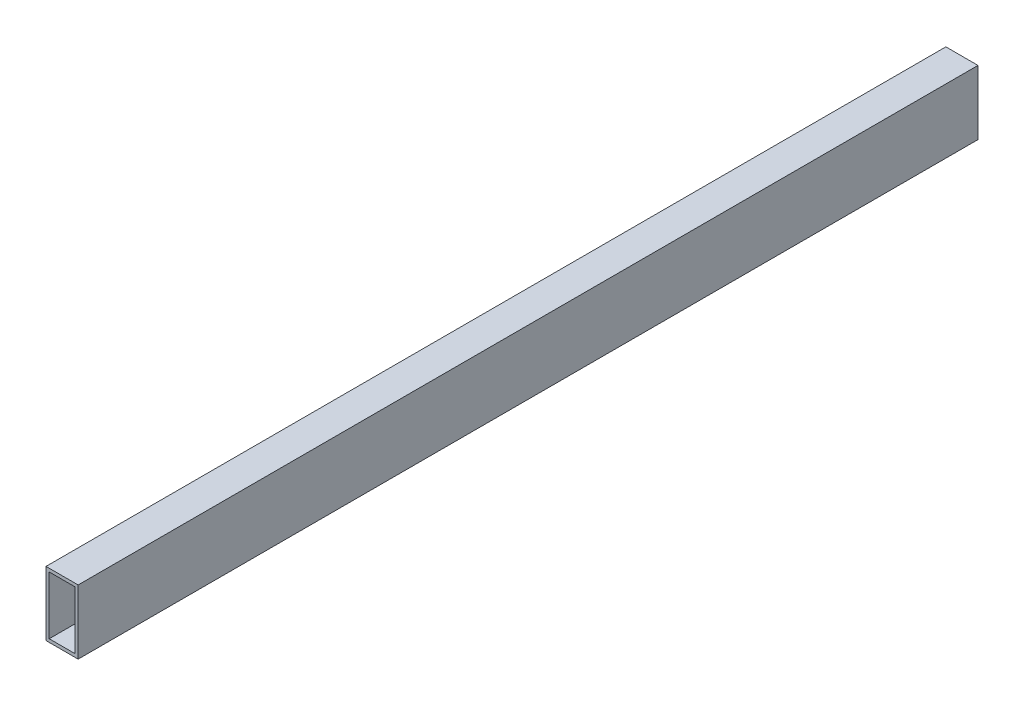
ISO-10303-21;
HEADER;
FILE_DESCRIPTION(('STEP AP214'),'2;1');
FILE_NAME('part.step','',(''),(''),'','','');
FILE_SCHEMA(('AUTOMOTIVE_DESIGN { 1 0 10303 214 1 1 1 1 }'));
ENDSEC;
DATA;
#1=APPLICATION_CONTEXT('core data for automotive mechanical design processes');
#2=APPLICATION_PROTOCOL_DEFINITION('international standard','automotive_design',2000,#1);
#3=PRODUCT_CONTEXT('',#1,'mechanical');
#4=PRODUCT('Part','Part','',(#3));
#5=PRODUCT_RELATED_PRODUCT_CATEGORY('part','',(#4));
#6=PRODUCT_DEFINITION_FORMATION('','',#4);
#7=PRODUCT_DEFINITION_CONTEXT('part definition',#1,'design');
#8=PRODUCT_DEFINITION('design','',#6,#7);
#9=PRODUCT_DEFINITION_SHAPE('','',#8);
#10=(LENGTH_UNIT() NAMED_UNIT(*) SI_UNIT(.MILLI.,.METRE.));
#11=(NAMED_UNIT(*) PLANE_ANGLE_UNIT() SI_UNIT($,.RADIAN.));
#12=(NAMED_UNIT(*) SI_UNIT($,.STERADIAN.) SOLID_ANGLE_UNIT());
#13=UNCERTAINTY_MEASURE_WITH_UNIT(LENGTH_MEASURE(1.E-05),#10,'distance_accuracy_value','');
#14=(GEOMETRIC_REPRESENTATION_CONTEXT(3) GLOBAL_UNCERTAINTY_ASSIGNED_CONTEXT((#13)) GLOBAL_UNIT_ASSIGNED_CONTEXT((#10,
#11,#12)) REPRESENTATION_CONTEXT('',''));
#15=CARTESIAN_POINT('',(0.,0.,0.));
#16=DIRECTION('',(0.,0.,1.));
#17=DIRECTION('',(1.,0.,0.));
#18=AXIS2_PLACEMENT_3D('',#15,#16,#17);
#19=CARTESIAN_POINT('',(0.,0.,280.));
#20=DIRECTION('',(0.,0.,-1.));
#21=DIRECTION('',(-1.,0.,0.));
#22=AXIS2_PLACEMENT_3D('',#19,#20,#21);
#23=PLANE('',#22);
#24=DIRECTION('',(0.,1.,0.));
#25=VECTOR('',#24,1.);
#26=CARTESIAN_POINT('',(5.,-10.,280.));
#27=LINE('',#26,#25);
#28=CARTESIAN_POINT('',(5.,-10.,280.));
#29=VERTEX_POINT('',#28);
#30=CARTESIAN_POINT('',(5.,10.,280.));
#31=VERTEX_POINT('',#30);
#32=EDGE_CURVE('E138',#29,#31,#27,.T.);
#33=ORIENTED_EDGE('',*,*,#32,.T.);
#34=DIRECTION('',(-1.,0.,0.));
#35=VECTOR('',#34,1.);
#36=CARTESIAN_POINT('',(-5.,10.,280.));
#37=LINE('',#36,#35);
#38=CARTESIAN_POINT('',(-5.,10.,280.));
#39=VERTEX_POINT('',#38);
#40=EDGE_CURVE('E141',#31,#39,#37,.T.);
#41=ORIENTED_EDGE('',*,*,#40,.T.);
#42=DIRECTION('',(0.,-1.,0.));
#43=VECTOR('',#42,1.);
#44=CARTESIAN_POINT('',(-5.,-10.,280.));
#45=LINE('',#44,#43);
#46=CARTESIAN_POINT('',(-5.,-10.,280.));
#47=VERTEX_POINT('',#46);
#48=EDGE_CURVE('E144',#39,#47,#45,.T.);
#49=ORIENTED_EDGE('',*,*,#48,.T.);
#50=DIRECTION('',(1.,0.,0.));
#51=VECTOR('',#50,1.);
#52=CARTESIAN_POINT('',(-5.,-10.,280.));
#53=LINE('',#52,#51);
#54=EDGE_CURVE('E146',#47,#29,#53,.T.);
#55=ORIENTED_EDGE('',*,*,#54,.T.);
#56=EDGE_LOOP('',(#33,#41,#49,#55));
#57=FACE_BOUND('',#56,.T.);
#58=DIRECTION('',(0.,-1.,0.));
#59=VECTOR('',#58,1.);
#60=CARTESIAN_POINT('',(-4.,-9.,280.));
#61=LINE('',#60,#59);
#62=CARTESIAN_POINT('',(-4.,9.,280.));
#63=VERTEX_POINT('',#62);
#64=CARTESIAN_POINT('',(-4.,-9.,280.));
#65=VERTEX_POINT('',#64);
#66=EDGE_CURVE('E102',#63,#65,#61,.T.);
#67=ORIENTED_EDGE('',*,*,#66,.F.);
#68=DIRECTION('',(-1.,0.,0.));
#69=VECTOR('',#68,1.);
#70=CARTESIAN_POINT('',(-4.,9.,280.));
#71=LINE('',#70,#69);
#72=CARTESIAN_POINT('',(4.,9.,280.));
#73=VERTEX_POINT('',#72);
#74=EDGE_CURVE('E124',#73,#63,#71,.T.);
#75=ORIENTED_EDGE('',*,*,#74,.F.);
#76=DIRECTION('',(0.,1.,0.));
#77=VECTOR('',#76,1.);
#78=CARTESIAN_POINT('',(4.,-9.,280.));
#79=LINE('',#78,#77);
#80=CARTESIAN_POINT('',(4.,-9.,280.));
#81=VERTEX_POINT('',#80);
#82=EDGE_CURVE('E122',#81,#73,#79,.T.);
#83=ORIENTED_EDGE('',*,*,#82,.F.);
#84=DIRECTION('',(1.,0.,0.));
#85=VECTOR('',#84,1.);
#86=CARTESIAN_POINT('',(-4.,-9.,280.));
#87=LINE('',#86,#85);
#88=EDGE_CURVE('E110',#65,#81,#87,.T.);
#89=ORIENTED_EDGE('',*,*,#88,.F.);
#90=EDGE_LOOP('',(#67,#75,#83,#89));
#91=FACE_BOUND('',#90,.T.);
#92=ADVANCED_FACE('F37',(#57,#91),#23,.F.);
#93=CARTESIAN_POINT('',(0.,0.,0.));
#94=DIRECTION('',(0.,0.,-1.));
#95=DIRECTION('',(-1.,0.,0.));
#96=AXIS2_PLACEMENT_3D('',#93,#94,#95);
#97=PLANE('',#96);
#98=DIRECTION('',(0.,1.,0.));
#99=VECTOR('',#98,1.);
#100=CARTESIAN_POINT('',(5.,-10.,0.));
#101=LINE('',#100,#99);
#102=CARTESIAN_POINT('',(5.,-10.,0.));
#103=VERTEX_POINT('',#102);
#104=CARTESIAN_POINT('',(5.,10.,0.));
#105=VERTEX_POINT('',#104);
#106=EDGE_CURVE('E118',#103,#105,#101,.T.);
#107=ORIENTED_EDGE('',*,*,#106,.F.);
#108=DIRECTION('',(1.,0.,0.));
#109=VECTOR('',#108,1.);
#110=CARTESIAN_POINT('',(-5.,-10.,0.));
#111=LINE('',#110,#109);
#112=CARTESIAN_POINT('',(-5.,-10.,0.));
#113=VERTEX_POINT('',#112);
#114=EDGE_CURVE('E142',#113,#103,#111,.T.);
#115=ORIENTED_EDGE('',*,*,#114,.F.);
#116=DIRECTION('',(0.,-1.,0.));
#117=VECTOR('',#116,1.);
#118=CARTESIAN_POINT('',(-5.,-10.,0.));
#119=LINE('',#118,#117);
#120=CARTESIAN_POINT('',(-5.,10.,0.));
#121=VERTEX_POINT('',#120);
#122=EDGE_CURVE('E153',#121,#113,#119,.T.);
#123=ORIENTED_EDGE('',*,*,#122,.F.);
#124=DIRECTION('',(-1.,0.,0.));
#125=VECTOR('',#124,1.);
#126=CARTESIAN_POINT('',(-5.,10.,0.));
#127=LINE('',#126,#125);
#128=EDGE_CURVE('E151',#105,#121,#127,.T.);
#129=ORIENTED_EDGE('',*,*,#128,.F.);
#130=EDGE_LOOP('',(#107,#115,#123,#129));
#131=FACE_BOUND('',#130,.T.);
#132=DIRECTION('',(-1.,0.,0.));
#133=VECTOR('',#132,1.);
#134=CARTESIAN_POINT('',(-4.,9.,0.));
#135=LINE('',#134,#133);
#136=CARTESIAN_POINT('',(4.,9.,0.));
#137=VERTEX_POINT('',#136);
#138=CARTESIAN_POINT('',(-4.,9.,0.));
#139=VERTEX_POINT('',#138);
#140=EDGE_CURVE('E111',#137,#139,#135,.T.);
#141=ORIENTED_EDGE('',*,*,#140,.T.);
#142=DIRECTION('',(0.,-1.,0.));
#143=VECTOR('',#142,1.);
#144=CARTESIAN_POINT('',(-4.,-9.,0.));
#145=LINE('',#144,#143);
#146=CARTESIAN_POINT('',(-4.,-9.,0.));
#147=VERTEX_POINT('',#146);
#148=EDGE_CURVE('E60',#139,#147,#145,.T.);
#149=ORIENTED_EDGE('',*,*,#148,.T.);
#150=DIRECTION('',(1.,0.,0.));
#151=VECTOR('',#150,1.);
#152=CARTESIAN_POINT('',(-4.,-9.,0.));
#153=LINE('',#152,#151);
#154=CARTESIAN_POINT('',(4.,-9.,0.));
#155=VERTEX_POINT('',#154);
#156=EDGE_CURVE('E117',#147,#155,#153,.T.);
#157=ORIENTED_EDGE('',*,*,#156,.T.);
#158=DIRECTION('',(0.,1.,0.));
#159=VECTOR('',#158,1.);
#160=CARTESIAN_POINT('',(4.,-9.,0.));
#161=LINE('',#160,#159);
#162=EDGE_CURVE('E130',#155,#137,#161,.T.);
#163=ORIENTED_EDGE('',*,*,#162,.T.);
#164=EDGE_LOOP('',(#141,#149,#157,#163));
#165=FACE_BOUND('',#164,.T.);
#166=ADVANCED_FACE('F171',(#131,#165),#97,.T.);
#167=CARTESIAN_POINT('',(5.,-10.,280.));
#168=DIRECTION('',(-1.,0.,0.));
#169=DIRECTION('',(0.,0.,1.));
#170=AXIS2_PLACEMENT_3D('',#167,#168,#169);
#171=PLANE('',#170);
#172=ORIENTED_EDGE('',*,*,#106,.T.);
#173=DIRECTION('',(0.,0.,-1.));
#174=VECTOR('',#173,1.);
#175=CARTESIAN_POINT('',(5.,10.,280.));
#176=LINE('',#175,#174);
#177=EDGE_CURVE('E11',#31,#105,#176,.T.);
#178=ORIENTED_EDGE('',*,*,#177,.F.);
#179=ORIENTED_EDGE('',*,*,#32,.F.);
#180=DIRECTION('',(0.,0.,-1.));
#181=VECTOR('',#180,1.);
#182=CARTESIAN_POINT('',(5.,-10.,280.));
#183=LINE('',#182,#181);
#184=EDGE_CURVE('E148',#29,#103,#183,.T.);
#185=ORIENTED_EDGE('',*,*,#184,.T.);
#186=EDGE_LOOP('',(#172,#178,#179,#185));
#187=FACE_BOUND('',#186,.T.);
#188=ADVANCED_FACE('F39',(#187),#171,.F.);
#189=CARTESIAN_POINT('',(-5.,10.,280.));
#190=DIRECTION('',(0.,-1.,0.));
#191=DIRECTION('',(0.,0.,-1.));
#192=AXIS2_PLACEMENT_3D('',#189,#190,#191);
#193=PLANE('',#192);
#194=ORIENTED_EDGE('',*,*,#128,.T.);
#195=DIRECTION('',(0.,0.,-1.));
#196=VECTOR('',#195,1.);
#197=CARTESIAN_POINT('',(-5.,10.,280.));
#198=LINE('',#197,#196);
#199=EDGE_CURVE('E45',#39,#121,#198,.T.);
#200=ORIENTED_EDGE('',*,*,#199,.F.);
#201=ORIENTED_EDGE('',*,*,#40,.F.);
#202=ORIENTED_EDGE('',*,*,#177,.T.);
#203=EDGE_LOOP('',(#194,#200,#201,#202));
#204=FACE_BOUND('',#203,.T.);
#205=ADVANCED_FACE('F181',(#204),#193,.F.);
#206=CARTESIAN_POINT('',(-5.,-10.,280.));
#207=DIRECTION('',(1.,0.,0.));
#208=DIRECTION('',(0.,0.,-1.));
#209=AXIS2_PLACEMENT_3D('',#206,#207,#208);
#210=PLANE('',#209);
#211=ORIENTED_EDGE('',*,*,#122,.T.);
#212=DIRECTION('',(0.,0.,-1.));
#213=VECTOR('',#212,1.);
#214=CARTESIAN_POINT('',(-5.,-10.,280.));
#215=LINE('',#214,#213);
#216=EDGE_CURVE('E158',#47,#113,#215,.T.);
#217=ORIENTED_EDGE('',*,*,#216,.F.);
#218=ORIENTED_EDGE('',*,*,#48,.F.);
#219=ORIENTED_EDGE('',*,*,#199,.T.);
#220=EDGE_LOOP('',(#211,#217,#218,#219));
#221=FACE_BOUND('',#220,.T.);
#222=ADVANCED_FACE('F165',(#221),#210,.F.);
#223=CARTESIAN_POINT('',(-5.,-10.,280.));
#224=DIRECTION('',(0.,1.,0.));
#225=DIRECTION('',(0.,0.,1.));
#226=AXIS2_PLACEMENT_3D('',#223,#224,#225);
#227=PLANE('',#226);
#228=ORIENTED_EDGE('',*,*,#114,.T.);
#229=ORIENTED_EDGE('',*,*,#184,.F.);
#230=ORIENTED_EDGE('',*,*,#54,.F.);
#231=ORIENTED_EDGE('',*,*,#216,.T.);
#232=EDGE_LOOP('',(#228,#229,#230,#231));
#233=FACE_BOUND('',#232,.T.);
#234=ADVANCED_FACE('F175',(#233),#227,.F.);
#235=CARTESIAN_POINT('',(-4.,-9.,280.));
#236=DIRECTION('',(1.,0.,0.));
#237=DIRECTION('',(0.,0.,-1.));
#238=AXIS2_PLACEMENT_3D('',#235,#236,#237);
#239=PLANE('',#238);
#240=ORIENTED_EDGE('',*,*,#148,.F.);
#241=DIRECTION('',(0.,0.,-1.));
#242=VECTOR('',#241,1.);
#243=CARTESIAN_POINT('',(-4.,9.,280.));
#244=LINE('',#243,#242);
#245=EDGE_CURVE('E106',#63,#139,#244,.T.);
#246=ORIENTED_EDGE('',*,*,#245,.F.);
#247=ORIENTED_EDGE('',*,*,#66,.T.);
#248=DIRECTION('',(0.,0.,-1.));
#249=VECTOR('',#248,1.);
#250=CARTESIAN_POINT('',(-4.,-9.,280.));
#251=LINE('',#250,#249);
#252=EDGE_CURVE('E105',#65,#147,#251,.T.);
#253=ORIENTED_EDGE('',*,*,#252,.T.);
#254=EDGE_LOOP('',(#240,#246,#247,#253));
#255=FACE_BOUND('',#254,.T.);
#256=ADVANCED_FACE('F104',(#255),#239,.T.);
#257=CARTESIAN_POINT('',(-4.,-9.,280.));
#258=DIRECTION('',(0.,1.,0.));
#259=DIRECTION('',(0.,0.,1.));
#260=AXIS2_PLACEMENT_3D('',#257,#258,#259);
#261=PLANE('',#260);
#262=ORIENTED_EDGE('',*,*,#156,.F.);
#263=ORIENTED_EDGE('',*,*,#252,.F.);
#264=ORIENTED_EDGE('',*,*,#88,.T.);
#265=DIRECTION('',(0.,0.,-1.));
#266=VECTOR('',#265,1.);
#267=CARTESIAN_POINT('',(4.,-9.,280.));
#268=LINE('',#267,#266);
#269=EDGE_CURVE('E119',#81,#155,#268,.T.);
#270=ORIENTED_EDGE('',*,*,#269,.T.);
#271=EDGE_LOOP('',(#262,#263,#264,#270));
#272=FACE_BOUND('',#271,.T.);
#273=ADVANCED_FACE('F114',(#272),#261,.T.);
#274=CARTESIAN_POINT('',(4.,-9.,280.));
#275=DIRECTION('',(-1.,0.,0.));
#276=DIRECTION('',(0.,-1.,0.));
#277=AXIS2_PLACEMENT_3D('',#274,#275,#276);
#278=PLANE('',#277);
#279=ORIENTED_EDGE('',*,*,#162,.F.);
#280=ORIENTED_EDGE('',*,*,#269,.F.);
#281=ORIENTED_EDGE('',*,*,#82,.T.);
#282=DIRECTION('',(0.,0.,-1.));
#283=VECTOR('',#282,1.);
#284=CARTESIAN_POINT('',(4.,9.,280.));
#285=LINE('',#284,#283);
#286=EDGE_CURVE('E52',#73,#137,#285,.T.);
#287=ORIENTED_EDGE('',*,*,#286,.T.);
#288=EDGE_LOOP('',(#279,#280,#281,#287));
#289=FACE_BOUND('',#288,.T.);
#290=ADVANCED_FACE('F204',(#289),#278,.T.);
#291=CARTESIAN_POINT('',(-4.,9.,280.));
#292=DIRECTION('',(0.,-1.,0.));
#293=DIRECTION('',(0.,0.,-1.));
#294=AXIS2_PLACEMENT_3D('',#291,#292,#293);
#295=PLANE('',#294);
#296=ORIENTED_EDGE('',*,*,#140,.F.);
#297=ORIENTED_EDGE('',*,*,#286,.F.);
#298=ORIENTED_EDGE('',*,*,#74,.T.);
#299=ORIENTED_EDGE('',*,*,#245,.T.);
#300=EDGE_LOOP('',(#296,#297,#298,#299));
#301=FACE_BOUND('',#300,.T.);
#302=ADVANCED_FACE('F208',(#301),#295,.T.);
#303=CLOSED_SHELL('',(#92,#166,#188,#205,#222,#234,#256,#273,#290,#302));
#304=MANIFOLD_SOLID_BREP('B2',#303);
#305=ADVANCED_BREP_SHAPE_REPRESENTATION('',(#18,#304),#14);
#306=SHAPE_DEFINITION_REPRESENTATION(#9,#305);
ENDSEC;
END-ISO-10303-21;
